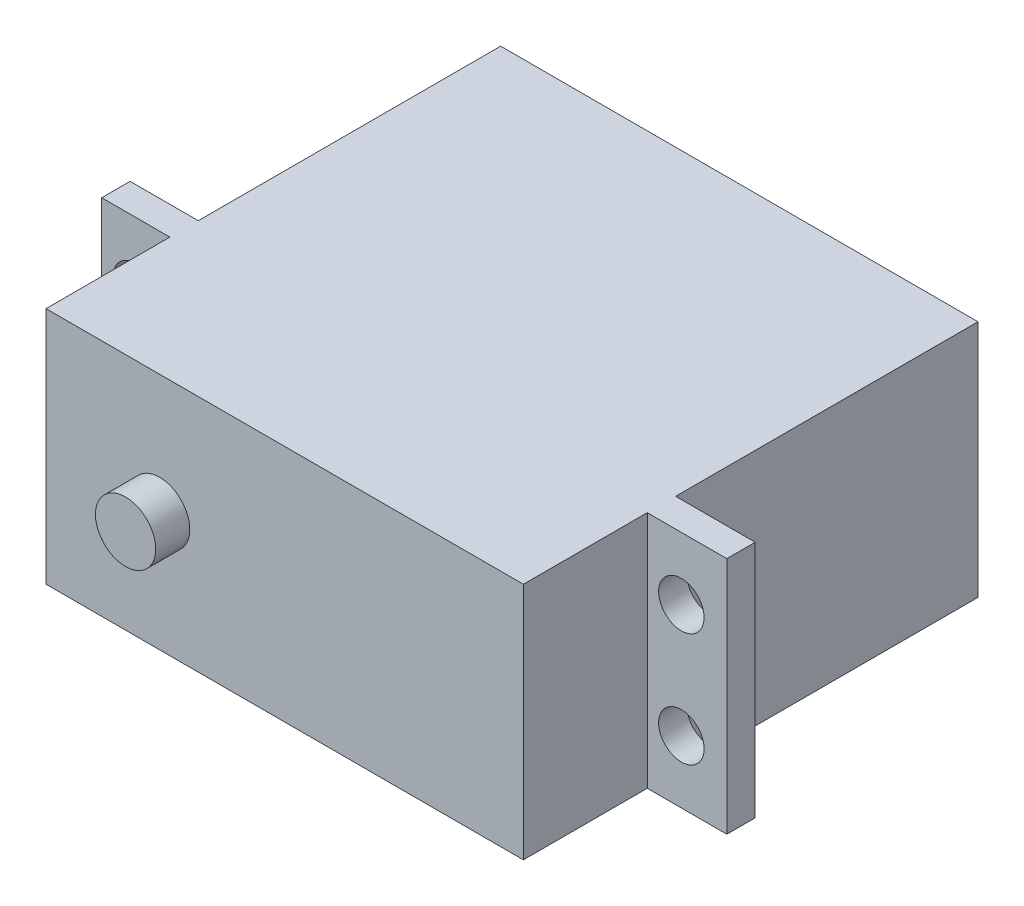
ISO-10303-21;
HEADER;
FILE_DESCRIPTION(('STEP AP214'),'2;1');
FILE_NAME('part.step','',(''),(''),'','','');
FILE_SCHEMA(('AUTOMOTIVE_DESIGN { 1 0 10303 214 1 1 1 1 }'));
ENDSEC;
DATA;
#1=APPLICATION_CONTEXT('core data for automotive mechanical design processes');
#2=APPLICATION_PROTOCOL_DEFINITION('international standard','automotive_design',2000,#1);
#3=PRODUCT_CONTEXT('',#1,'mechanical');
#4=PRODUCT('Part','Part','',(#3));
#5=PRODUCT_RELATED_PRODUCT_CATEGORY('part','',(#4));
#6=PRODUCT_DEFINITION_FORMATION('','',#4);
#7=PRODUCT_DEFINITION_CONTEXT('part definition',#1,'design');
#8=PRODUCT_DEFINITION('design','',#6,#7);
#9=PRODUCT_DEFINITION_SHAPE('','',#8);
#10=(LENGTH_UNIT() NAMED_UNIT(*) SI_UNIT(.MILLI.,.METRE.));
#11=(NAMED_UNIT(*) PLANE_ANGLE_UNIT() SI_UNIT($,.RADIAN.));
#12=(NAMED_UNIT(*) SI_UNIT($,.STERADIAN.) SOLID_ANGLE_UNIT());
#13=UNCERTAINTY_MEASURE_WITH_UNIT(LENGTH_MEASURE(1.E-05),#10,'distance_accuracy_value','');
#14=(GEOMETRIC_REPRESENTATION_CONTEXT(3) GLOBAL_UNCERTAINTY_ASSIGNED_CONTEXT((#13)) GLOBAL_UNIT_ASSIGNED_CONTEXT((#10,
#11,#12)) REPRESENTATION_CONTEXT('',''));
#15=CARTESIAN_POINT('',(0.,0.,0.));
#16=DIRECTION('',(0.,0.,1.));
#17=DIRECTION('',(1.,0.,0.));
#18=AXIS2_PLACEMENT_3D('',#15,#16,#17);
#19=CARTESIAN_POINT('',(-10.,-10.5,-40.));
#20=DIRECTION('',(-1.,0.,0.));
#21=DIRECTION('',(0.,0.,1.));
#22=AXIS2_PLACEMENT_3D('',#19,#20,#21);
#23=PLANE('',#22);
#24=DIRECTION('',(0.,-1.,0.));
#25=VECTOR('',#24,1.);
#26=CARTESIAN_POINT('',(-10.,-10.5,-13.4));
#27=LINE('',#26,#25);
#28=CARTESIAN_POINT('',(-10.,10.5,-13.4));
#29=VERTEX_POINT('',#28);
#30=CARTESIAN_POINT('',(-10.,-10.5,-13.4));
#31=VERTEX_POINT('',#30);
#32=EDGE_CURVE('E186',#29,#31,#27,.T.);
#33=ORIENTED_EDGE('',*,*,#32,.F.);
#34=DIRECTION('',(0.,0.,1.));
#35=VECTOR('',#34,1.);
#36=CARTESIAN_POINT('',(-10.,10.5,-40.));
#37=LINE('',#36,#35);
#38=CARTESIAN_POINT('',(-10.,10.5,-40.));
#39=VERTEX_POINT('',#38);
#40=EDGE_CURVE('E11',#39,#29,#37,.T.);
#41=ORIENTED_EDGE('',*,*,#40,.F.);
#42=DIRECTION('',(0.,-1.,0.));
#43=VECTOR('',#42,1.);
#44=CARTESIAN_POINT('',(-10.,-10.5,-40.));
#45=LINE('',#44,#43);
#46=CARTESIAN_POINT('',(-10.,-10.5,-40.));
#47=VERTEX_POINT('',#46);
#48=EDGE_CURVE('E189',#39,#47,#45,.T.);
#49=ORIENTED_EDGE('',*,*,#48,.T.);
#50=DIRECTION('',(0.,0.,1.));
#51=VECTOR('',#50,1.);
#52=CARTESIAN_POINT('',(-10.,-10.5,-40.));
#53=LINE('',#52,#51);
#54=EDGE_CURVE('E218',#47,#31,#53,.T.);
#55=ORIENTED_EDGE('',*,*,#54,.T.);
#56=EDGE_LOOP('',(#33,#41,#49,#55));
#57=FACE_BOUND('',#56,.T.);
#58=ADVANCED_FACE('F38',(#57),#23,.T.);
#59=CARTESIAN_POINT('',(32.,-10.5,-40.));
#60=DIRECTION('',(1.,0.,0.));
#61=DIRECTION('',(0.,0.,-1.));
#62=AXIS2_PLACEMENT_3D('',#59,#60,#61);
#63=PLANE('',#62);
#64=DIRECTION('',(0.,1.,0.));
#65=VECTOR('',#64,1.);
#66=CARTESIAN_POINT('',(32.,-10.5,-13.4));
#67=LINE('',#66,#65);
#68=CARTESIAN_POINT('',(32.,-10.5,-13.4));
#69=VERTEX_POINT('',#68);
#70=CARTESIAN_POINT('',(32.,10.5,-13.4));
#71=VERTEX_POINT('',#70);
#72=EDGE_CURVE('E135',#69,#71,#67,.T.);
#73=ORIENTED_EDGE('',*,*,#72,.F.);
#74=DIRECTION('',(0.,0.,1.));
#75=VECTOR('',#74,1.);
#76=CARTESIAN_POINT('',(32.,-10.5,-40.));
#77=LINE('',#76,#75);
#78=CARTESIAN_POINT('',(32.,-10.5,-40.));
#79=VERTEX_POINT('',#78);
#80=EDGE_CURVE('E214',#79,#69,#77,.T.);
#81=ORIENTED_EDGE('',*,*,#80,.F.);
#82=DIRECTION('',(0.,1.,0.));
#83=VECTOR('',#82,1.);
#84=CARTESIAN_POINT('',(32.,-10.5,-40.));
#85=LINE('',#84,#83);
#86=CARTESIAN_POINT('',(32.,10.5,-40.));
#87=VERTEX_POINT('',#86);
#88=EDGE_CURVE('E196',#79,#87,#85,.T.);
#89=ORIENTED_EDGE('',*,*,#88,.T.);
#90=DIRECTION('',(0.,0.,1.));
#91=VECTOR('',#90,1.);
#92=CARTESIAN_POINT('',(32.,10.5,-40.));
#93=LINE('',#92,#91);
#94=EDGE_CURVE('E63',#87,#71,#93,.T.);
#95=ORIENTED_EDGE('',*,*,#94,.T.);
#96=EDGE_LOOP('',(#73,#81,#89,#95));
#97=FACE_BOUND('',#96,.T.);
#98=ADVANCED_FACE('F260',(#97),#63,.T.);
#99=DIRECTION('',(0.,1.,0.));
#100=VECTOR('',#99,1.);
#101=CARTESIAN_POINT('',(-10.,-10.5,-10.9));
#102=LINE('',#101,#100);
#103=CARTESIAN_POINT('',(-10.,-10.5,-10.9));
#104=VERTEX_POINT('',#103);
#105=CARTESIAN_POINT('',(-10.,10.5,-10.9));
#106=VERTEX_POINT('',#105);
#107=EDGE_CURVE('E183',#104,#106,#102,.T.);
#108=ORIENTED_EDGE('',*,*,#107,.F.);
#109=CARTESIAN_POINT('',(-10.,-10.5,0.));
#110=VERTEX_POINT('',#109);
#111=EDGE_CURVE('E201',#104,#110,#53,.T.);
#112=ORIENTED_EDGE('',*,*,#111,.T.);
#113=DIRECTION('',(0.,-1.,0.));
#114=VECTOR('',#113,1.);
#115=CARTESIAN_POINT('',(-10.,-10.5,0.));
#116=LINE('',#115,#114);
#117=CARTESIAN_POINT('',(-10.,10.5,0.));
#118=VERTEX_POINT('',#117);
#119=EDGE_CURVE('E188',#118,#110,#116,.T.);
#120=ORIENTED_EDGE('',*,*,#119,.F.);
#121=EDGE_CURVE('E47',#106,#118,#37,.T.);
#122=ORIENTED_EDGE('',*,*,#121,.F.);
#123=EDGE_LOOP('',(#108,#112,#120,#122));
#124=FACE_BOUND('',#123,.T.);
#125=ADVANCED_FACE('F40',(#124),#23,.T.);
#126=CARTESIAN_POINT('',(-10.,10.5,-40.));
#127=DIRECTION('',(0.,1.,0.));
#128=DIRECTION('',(0.,0.,1.));
#129=AXIS2_PLACEMENT_3D('',#126,#127,#128);
#130=PLANE('',#129);
#131=CARTESIAN_POINT('',(32.,10.5,-10.9));
#132=VERTEX_POINT('',#131);
#133=CARTESIAN_POINT('',(32.,10.5,0.));
#134=VERTEX_POINT('',#133);
#135=EDGE_CURVE('E213',#132,#134,#93,.T.);
#136=ORIENTED_EDGE('',*,*,#135,.F.);
#137=DIRECTION('',(1.,0.,0.));
#138=VECTOR('',#137,1.);
#139=CARTESIAN_POINT('',(-16.,10.5,-10.9));
#140=LINE('',#139,#138);
#141=CARTESIAN_POINT('',(39.,10.5,-10.9));
#142=VERTEX_POINT('',#141);
#143=EDGE_CURVE('E143',#132,#142,#140,.T.);
#144=ORIENTED_EDGE('',*,*,#143,.T.);
#145=DIRECTION('',(0.,0.,1.));
#146=VECTOR('',#145,1.);
#147=CARTESIAN_POINT('',(39.,10.5,-13.4));
#148=LINE('',#147,#146);
#149=CARTESIAN_POINT('',(39.,10.5,-13.4));
#150=VERTEX_POINT('',#149);
#151=EDGE_CURVE('E140',#150,#142,#148,.T.);
#152=ORIENTED_EDGE('',*,*,#151,.F.);
#153=DIRECTION('',(1.,0.,0.));
#154=VECTOR('',#153,1.);
#155=CARTESIAN_POINT('',(-16.,10.5,-13.4));
#156=LINE('',#155,#154);
#157=EDGE_CURVE('E129',#71,#150,#156,.T.);
#158=ORIENTED_EDGE('',*,*,#157,.F.);
#159=ORIENTED_EDGE('',*,*,#94,.F.);
#160=DIRECTION('',(-1.,0.,0.));
#161=VECTOR('',#160,1.);
#162=CARTESIAN_POINT('',(-10.,10.5,-40.));
#163=LINE('',#162,#161);
#164=EDGE_CURVE('E198',#87,#39,#163,.T.);
#165=ORIENTED_EDGE('',*,*,#164,.T.);
#166=ORIENTED_EDGE('',*,*,#40,.T.);
#167=CARTESIAN_POINT('',(-16.,10.5,-13.4));
#168=VERTEX_POINT('',#167);
#169=EDGE_CURVE('E136',#168,#29,#156,.T.);
#170=ORIENTED_EDGE('',*,*,#169,.F.);
#171=DIRECTION('',(0.,0.,1.));
#172=VECTOR('',#171,1.);
#173=CARTESIAN_POINT('',(-16.,10.5,-13.4));
#174=LINE('',#173,#172);
#175=CARTESIAN_POINT('',(-16.,10.5,-10.9));
#176=VERTEX_POINT('',#175);
#177=EDGE_CURVE('E165',#168,#176,#174,.T.);
#178=ORIENTED_EDGE('',*,*,#177,.T.);
#179=EDGE_CURVE('E55',#176,#106,#140,.T.);
#180=ORIENTED_EDGE('',*,*,#179,.T.);
#181=ORIENTED_EDGE('',*,*,#121,.T.);
#182=DIRECTION('',(-1.,0.,0.));
#183=VECTOR('',#182,1.);
#184=CARTESIAN_POINT('',(-10.,10.5,0.));
#185=LINE('',#184,#183);
#186=EDGE_CURVE('E193',#134,#118,#185,.T.);
#187=ORIENTED_EDGE('',*,*,#186,.F.);
#188=EDGE_LOOP('',(#136,#144,#152,#158,#159,#165,#166,#170,#178,#180,#181,#187));
#189=FACE_BOUND('',#188,.T.);
#190=ADVANCED_FACE('F141',(#189),#130,.T.);
#191=DIRECTION('',(0.,-1.,0.));
#192=VECTOR('',#191,1.);
#193=CARTESIAN_POINT('',(32.,-10.5,-10.9));
#194=LINE('',#193,#192);
#195=CARTESIAN_POINT('',(32.,-10.5,-10.9));
#196=VERTEX_POINT('',#195);
#197=EDGE_CURVE('E175',#132,#196,#194,.T.);
#198=ORIENTED_EDGE('',*,*,#197,.F.);
#199=ORIENTED_EDGE('',*,*,#135,.T.);
#200=DIRECTION('',(0.,1.,0.));
#201=VECTOR('',#200,1.);
#202=CARTESIAN_POINT('',(32.,-10.5,0.));
#203=LINE('',#202,#201);
#204=CARTESIAN_POINT('',(32.,-10.5,0.));
#205=VERTEX_POINT('',#204);
#206=EDGE_CURVE('E207',#205,#134,#203,.T.);
#207=ORIENTED_EDGE('',*,*,#206,.F.);
#208=EDGE_CURVE('E217',#196,#205,#77,.T.);
#209=ORIENTED_EDGE('',*,*,#208,.F.);
#210=EDGE_LOOP('',(#198,#199,#207,#209));
#211=FACE_BOUND('',#210,.T.);
#212=ADVANCED_FACE('F266',(#211),#63,.T.);
#213=CARTESIAN_POINT('',(-10.,-10.5,-40.));
#214=DIRECTION('',(0.,-1.,0.));
#215=DIRECTION('',(0.,0.,-1.));
#216=AXIS2_PLACEMENT_3D('',#213,#214,#215);
#217=PLANE('',#216);
#218=ORIENTED_EDGE('',*,*,#111,.F.);
#219=DIRECTION('',(1.,0.,0.));
#220=VECTOR('',#219,1.);
#221=CARTESIAN_POINT('',(-16.,-10.5,-10.9));
#222=LINE('',#221,#220);
#223=CARTESIAN_POINT('',(-16.,-10.5,-10.9));
#224=VERTEX_POINT('',#223);
#225=EDGE_CURVE('E177',#224,#104,#222,.T.);
#226=ORIENTED_EDGE('',*,*,#225,.F.);
#227=DIRECTION('',(0.,0.,-1.));
#228=VECTOR('',#227,1.);
#229=CARTESIAN_POINT('',(-16.,-10.5,-13.4));
#230=LINE('',#229,#228);
#231=CARTESIAN_POINT('',(-16.,-10.5,-13.4));
#232=VERTEX_POINT('',#231);
#233=EDGE_CURVE('E137',#224,#232,#230,.T.);
#234=ORIENTED_EDGE('',*,*,#233,.T.);
#235=DIRECTION('',(1.,0.,0.));
#236=VECTOR('',#235,1.);
#237=CARTESIAN_POINT('',(-16.,-10.5,-13.4));
#238=LINE('',#237,#236);
#239=EDGE_CURVE('E172',#232,#31,#238,.T.);
#240=ORIENTED_EDGE('',*,*,#239,.T.);
#241=ORIENTED_EDGE('',*,*,#54,.F.);
#242=DIRECTION('',(1.,0.,0.));
#243=VECTOR('',#242,1.);
#244=CARTESIAN_POINT('',(-10.,-10.5,-40.));
#245=LINE('',#244,#243);
#246=EDGE_CURVE('E192',#47,#79,#245,.T.);
#247=ORIENTED_EDGE('',*,*,#246,.T.);
#248=ORIENTED_EDGE('',*,*,#80,.T.);
#249=CARTESIAN_POINT('',(39.,-10.5,-13.4));
#250=VERTEX_POINT('',#249);
#251=EDGE_CURVE('E176',#69,#250,#238,.T.);
#252=ORIENTED_EDGE('',*,*,#251,.T.);
#253=DIRECTION('',(0.,0.,-1.));
#254=VECTOR('',#253,1.);
#255=CARTESIAN_POINT('',(39.,-10.5,-13.4));
#256=LINE('',#255,#254);
#257=CARTESIAN_POINT('',(39.,-10.5,-10.9));
#258=VERTEX_POINT('',#257);
#259=EDGE_CURVE('E152',#258,#250,#256,.T.);
#260=ORIENTED_EDGE('',*,*,#259,.F.);
#261=EDGE_CURVE('E179',#196,#258,#222,.T.);
#262=ORIENTED_EDGE('',*,*,#261,.F.);
#263=ORIENTED_EDGE('',*,*,#208,.T.);
#264=DIRECTION('',(1.,0.,0.));
#265=VECTOR('',#264,1.);
#266=CARTESIAN_POINT('',(-10.,-10.5,0.));
#267=LINE('',#266,#265);
#268=EDGE_CURVE('E204',#110,#205,#267,.T.);
#269=ORIENTED_EDGE('',*,*,#268,.F.);
#270=EDGE_LOOP('',(#218,#226,#234,#240,#241,#247,#248,#252,#260,#262,#263,#269));
#271=FACE_BOUND('',#270,.T.);
#272=ADVANCED_FACE('F281',(#271),#217,.T.);
#273=CARTESIAN_POINT('',(0.,0.,-40.));
#274=DIRECTION('',(0.,0.,-1.));
#275=DIRECTION('',(-1.,0.,0.));
#276=AXIS2_PLACEMENT_3D('',#273,#274,#275);
#277=PLANE('',#276);
#278=ORIENTED_EDGE('',*,*,#48,.F.);
#279=ORIENTED_EDGE('',*,*,#164,.F.);
#280=ORIENTED_EDGE('',*,*,#88,.F.);
#281=ORIENTED_EDGE('',*,*,#246,.F.);
#282=EDGE_LOOP('',(#278,#279,#280,#281));
#283=FACE_BOUND('',#282,.T.);
#284=ADVANCED_FACE('F296',(#283),#277,.T.);
#285=CARTESIAN_POINT('',(0.,0.,0.));
#286=DIRECTION('',(0.,0.,-1.));
#287=DIRECTION('',(-1.,0.,0.));
#288=AXIS2_PLACEMENT_3D('',#285,#286,#287);
#289=PLANE('',#288);
#290=CARTESIAN_POINT('',(0.,0.,0.));
#291=DIRECTION('',(0.,0.,-1.));
#292=DIRECTION('',(-1.,0.,0.));
#293=AXIS2_PLACEMENT_3D('',#290,#291,#292);
#294=CIRCLE('',#293,2.65);
#295=CARTESIAN_POINT('',(-2.65,0.,0.));
#296=VERTEX_POINT('',#295);
#297=EDGE_CURVE('E242',#296,#296,#294,.T.);
#298=ORIENTED_EDGE('',*,*,#297,.T.);
#299=EDGE_LOOP('',(#298));
#300=FACE_BOUND('',#299,.T.);
#301=ORIENTED_EDGE('',*,*,#119,.T.);
#302=ORIENTED_EDGE('',*,*,#268,.T.);
#303=ORIENTED_EDGE('',*,*,#206,.T.);
#304=ORIENTED_EDGE('',*,*,#186,.T.);
#305=EDGE_LOOP('',(#301,#302,#303,#304));
#306=FACE_BOUND('',#305,.T.);
#307=ADVANCED_FACE('F285',(#300,#306),#289,.F.);
#308=CARTESIAN_POINT('',(39.,0.,0.));
#309=DIRECTION('',(-1.,0.,0.));
#310=DIRECTION('',(0.,0.,1.));
#311=AXIS2_PLACEMENT_3D('',#308,#309,#310);
#312=PLANE('',#311);
#313=DIRECTION('',(0.,1.,0.));
#314=VECTOR('',#313,1.);
#315=CARTESIAN_POINT('',(39.,10.5,-13.4));
#316=LINE('',#315,#314);
#317=EDGE_CURVE('E134',#250,#150,#316,.T.);
#318=ORIENTED_EDGE('',*,*,#317,.T.);
#319=ORIENTED_EDGE('',*,*,#151,.T.);
#320=DIRECTION('',(0.,-1.,0.));
#321=VECTOR('',#320,1.);
#322=CARTESIAN_POINT('',(39.,10.5,-10.9));
#323=LINE('',#322,#321);
#324=EDGE_CURVE('E147',#142,#258,#323,.T.);
#325=ORIENTED_EDGE('',*,*,#324,.T.);
#326=ORIENTED_EDGE('',*,*,#259,.T.);
#327=EDGE_LOOP('',(#318,#319,#325,#326));
#328=FACE_BOUND('',#327,.T.);
#329=ADVANCED_FACE('F150',(#328),#312,.F.);
#330=CARTESIAN_POINT('',(-16.,10.5,-10.9));
#331=DIRECTION('',(0.,0.,1.));
#332=DIRECTION('',(0.,-1.,0.));
#333=AXIS2_PLACEMENT_3D('',#330,#331,#332);
#334=PLANE('',#333);
#335=CARTESIAN_POINT('',(35.,5.,-10.9));
#336=DIRECTION('',(0.,0.,1.));
#337=DIRECTION('',(0.,-1.,0.));
#338=AXIS2_PLACEMENT_3D('',#335,#336,#337);
#339=CIRCLE('',#338,2.);
#340=CARTESIAN_POINT('',(35.,3.,-10.9));
#341=VERTEX_POINT('',#340);
#342=EDGE_CURVE('E235',#341,#341,#339,.T.);
#343=ORIENTED_EDGE('',*,*,#342,.F.);
#344=EDGE_LOOP('',(#343));
#345=FACE_BOUND('',#344,.T.);
#346=CARTESIAN_POINT('',(35.,-5.,-10.9));
#347=DIRECTION('',(0.,0.,1.));
#348=DIRECTION('',(0.,-1.,0.));
#349=AXIS2_PLACEMENT_3D('',#346,#347,#348);
#350=CIRCLE('',#349,2.);
#351=CARTESIAN_POINT('',(35.,-7.,-10.9));
#352=VERTEX_POINT('',#351);
#353=EDGE_CURVE('E153',#352,#352,#350,.T.);
#354=ORIENTED_EDGE('',*,*,#353,.F.);
#355=EDGE_LOOP('',(#354));
#356=FACE_BOUND('',#355,.T.);
#357=ORIENTED_EDGE('',*,*,#143,.F.);
#358=ORIENTED_EDGE('',*,*,#197,.T.);
#359=ORIENTED_EDGE('',*,*,#261,.T.);
#360=ORIENTED_EDGE('',*,*,#324,.F.);
#361=EDGE_LOOP('',(#357,#358,#359,#360));
#362=FACE_BOUND('',#361,.T.);
#363=ADVANCED_FACE('F290',(#345,#356,#362),#334,.T.);
#364=CARTESIAN_POINT('',(-16.,10.5,-13.4));
#365=DIRECTION('',(0.,0.,-1.));
#366=DIRECTION('',(0.,1.,0.));
#367=AXIS2_PLACEMENT_3D('',#364,#365,#366);
#368=PLANE('',#367);
#369=CARTESIAN_POINT('',(35.,5.,-13.4));
#370=DIRECTION('',(0.,0.,-1.));
#371=DIRECTION('',(-1.,0.,0.));
#372=AXIS2_PLACEMENT_3D('',#369,#370,#371);
#373=CIRCLE('',#372,2.);
#374=CARTESIAN_POINT('',(33.,5.,-13.4));
#375=VERTEX_POINT('',#374);
#376=EDGE_CURVE('E238',#375,#375,#373,.T.);
#377=ORIENTED_EDGE('',*,*,#376,.F.);
#378=EDGE_LOOP('',(#377));
#379=FACE_BOUND('',#378,.T.);
#380=CARTESIAN_POINT('',(35.,-5.,-13.4));
#381=DIRECTION('',(0.,0.,-1.));
#382=DIRECTION('',(1.,0.,0.));
#383=AXIS2_PLACEMENT_3D('',#380,#381,#382);
#384=CIRCLE('',#383,2.);
#385=CARTESIAN_POINT('',(37.,-5.,-13.4));
#386=VERTEX_POINT('',#385);
#387=EDGE_CURVE('E156',#386,#386,#384,.T.);
#388=ORIENTED_EDGE('',*,*,#387,.F.);
#389=EDGE_LOOP('',(#388));
#390=FACE_BOUND('',#389,.T.);
#391=ORIENTED_EDGE('',*,*,#251,.F.);
#392=ORIENTED_EDGE('',*,*,#72,.T.);
#393=ORIENTED_EDGE('',*,*,#157,.T.);
#394=ORIENTED_EDGE('',*,*,#317,.F.);
#395=EDGE_LOOP('',(#391,#392,#393,#394));
#396=FACE_BOUND('',#395,.T.);
#397=ADVANCED_FACE('F132',(#379,#390,#396),#368,.T.);
#398=CARTESIAN_POINT('',(-13.,5.,-13.4));
#399=DIRECTION('',(0.,0.,-1.));
#400=DIRECTION('',(1.,0.,0.));
#401=AXIS2_PLACEMENT_3D('',#398,#399,#400);
#402=CIRCLE('',#401,2.);
#403=CARTESIAN_POINT('',(-11.,5.,-13.4));
#404=VERTEX_POINT('',#403);
#405=EDGE_CURVE('E231',#404,#404,#402,.T.);
#406=ORIENTED_EDGE('',*,*,#405,.F.);
#407=EDGE_LOOP('',(#406));
#408=FACE_BOUND('',#407,.T.);
#409=CARTESIAN_POINT('',(-13.,-5.,-13.4));
#410=DIRECTION('',(0.,0.,-1.));
#411=DIRECTION('',(-1.,0.,0.));
#412=AXIS2_PLACEMENT_3D('',#409,#410,#411);
#413=CIRCLE('',#412,2.);
#414=CARTESIAN_POINT('',(-15.,-5.,-13.4));
#415=VERTEX_POINT('',#414);
#416=EDGE_CURVE('E222',#415,#415,#413,.T.);
#417=ORIENTED_EDGE('',*,*,#416,.F.);
#418=EDGE_LOOP('',(#417));
#419=FACE_BOUND('',#418,.T.);
#420=ORIENTED_EDGE('',*,*,#169,.T.);
#421=ORIENTED_EDGE('',*,*,#32,.T.);
#422=ORIENTED_EDGE('',*,*,#239,.F.);
#423=DIRECTION('',(0.,1.,0.));
#424=VECTOR('',#423,1.);
#425=CARTESIAN_POINT('',(-16.,10.5,-13.4));
#426=LINE('',#425,#424);
#427=EDGE_CURVE('E162',#232,#168,#426,.T.);
#428=ORIENTED_EDGE('',*,*,#427,.T.);
#429=EDGE_LOOP('',(#420,#421,#422,#428));
#430=FACE_BOUND('',#429,.T.);
#431=ADVANCED_FACE('F299',(#408,#419,#430),#368,.T.);
#432=CARTESIAN_POINT('',(-13.,5.,-10.9));
#433=DIRECTION('',(0.,0.,1.));
#434=DIRECTION('',(0.,-1.,0.));
#435=AXIS2_PLACEMENT_3D('',#432,#433,#434);
#436=CIRCLE('',#435,2.);
#437=CARTESIAN_POINT('',(-13.,3.,-10.9));
#438=VERTEX_POINT('',#437);
#439=EDGE_CURVE('E42',#438,#438,#436,.T.);
#440=ORIENTED_EDGE('',*,*,#439,.F.);
#441=EDGE_LOOP('',(#440));
#442=FACE_BOUND('',#441,.T.);
#443=CARTESIAN_POINT('',(-13.,-5.,-10.9));
#444=DIRECTION('',(0.,0.,1.));
#445=DIRECTION('',(0.,-1.,0.));
#446=AXIS2_PLACEMENT_3D('',#443,#444,#445);
#447=CIRCLE('',#446,2.);
#448=CARTESIAN_POINT('',(-13.,-7.,-10.9));
#449=VERTEX_POINT('',#448);
#450=EDGE_CURVE('E220',#449,#449,#447,.T.);
#451=ORIENTED_EDGE('',*,*,#450,.F.);
#452=EDGE_LOOP('',(#451));
#453=FACE_BOUND('',#452,.T.);
#454=ORIENTED_EDGE('',*,*,#225,.T.);
#455=ORIENTED_EDGE('',*,*,#107,.T.);
#456=ORIENTED_EDGE('',*,*,#179,.F.);
#457=DIRECTION('',(0.,-1.,0.));
#458=VECTOR('',#457,1.);
#459=CARTESIAN_POINT('',(-16.,10.5,-10.9));
#460=LINE('',#459,#458);
#461=EDGE_CURVE('E167',#176,#224,#460,.T.);
#462=ORIENTED_EDGE('',*,*,#461,.T.);
#463=EDGE_LOOP('',(#454,#455,#456,#462));
#464=FACE_BOUND('',#463,.T.);
#465=ADVANCED_FACE('F305',(#442,#453,#464),#334,.T.);
#466=CARTESIAN_POINT('',(-16.,0.,0.));
#467=DIRECTION('',(-1.,0.,0.));
#468=DIRECTION('',(0.,0.,1.));
#469=AXIS2_PLACEMENT_3D('',#466,#467,#468);
#470=PLANE('',#469);
#471=ORIENTED_EDGE('',*,*,#427,.F.);
#472=ORIENTED_EDGE('',*,*,#233,.F.);
#473=ORIENTED_EDGE('',*,*,#461,.F.);
#474=ORIENTED_EDGE('',*,*,#177,.F.);
#475=EDGE_LOOP('',(#471,#472,#473,#474));
#476=FACE_BOUND('',#475,.T.);
#477=ADVANCED_FACE('F304',(#476),#470,.T.);
#478=CARTESIAN_POINT('',(35.,-5.,-5.9));
#479=DIRECTION('',(0.,0.,-1.));
#480=DIRECTION('',(-1.,0.,0.));
#481=AXIS2_PLACEMENT_3D('',#478,#479,#480);
#482=CYLINDRICAL_SURFACE('',#481,2.);
#483=ORIENTED_EDGE('',*,*,#353,.T.);
#484=EDGE_LOOP('',(#483));
#485=FACE_BOUND('',#484,.T.);
#486=ORIENTED_EDGE('',*,*,#387,.T.);
#487=EDGE_LOOP('',(#486));
#488=FACE_BOUND('',#487,.T.);
#489=ADVANCED_FACE('F313',(#485,#488),#482,.F.);
#490=CARTESIAN_POINT('',(-13.,-5.,-5.9));
#491=DIRECTION('',(0.,0.,-1.));
#492=DIRECTION('',(-1.,0.,0.));
#493=AXIS2_PLACEMENT_3D('',#490,#491,#492);
#494=CYLINDRICAL_SURFACE('',#493,2.);
#495=ORIENTED_EDGE('',*,*,#450,.T.);
#496=EDGE_LOOP('',(#495));
#497=FACE_BOUND('',#496,.T.);
#498=ORIENTED_EDGE('',*,*,#416,.T.);
#499=EDGE_LOOP('',(#498));
#500=FACE_BOUND('',#499,.T.);
#501=ADVANCED_FACE('F333',(#497,#500),#494,.F.);
#502=CARTESIAN_POINT('',(-13.,5.,-5.9));
#503=DIRECTION('',(0.,0.,-1.));
#504=DIRECTION('',(-1.,0.,0.));
#505=AXIS2_PLACEMENT_3D('',#502,#503,#504);
#506=CYLINDRICAL_SURFACE('',#505,2.);
#507=ORIENTED_EDGE('',*,*,#439,.T.);
#508=EDGE_LOOP('',(#507));
#509=FACE_BOUND('',#508,.T.);
#510=ORIENTED_EDGE('',*,*,#405,.T.);
#511=EDGE_LOOP('',(#510));
#512=FACE_BOUND('',#511,.T.);
#513=ADVANCED_FACE('F340',(#509,#512),#506,.F.);
#514=CARTESIAN_POINT('',(35.,5.,-5.9));
#515=DIRECTION('',(0.,0.,-1.));
#516=DIRECTION('',(-1.,0.,0.));
#517=AXIS2_PLACEMENT_3D('',#514,#515,#516);
#518=CYLINDRICAL_SURFACE('',#517,2.);
#519=ORIENTED_EDGE('',*,*,#342,.T.);
#520=EDGE_LOOP('',(#519));
#521=FACE_BOUND('',#520,.T.);
#522=ORIENTED_EDGE('',*,*,#376,.T.);
#523=EDGE_LOOP('',(#522));
#524=FACE_BOUND('',#523,.T.);
#525=ADVANCED_FACE('F257',(#521,#524),#518,.F.);
#526=CARTESIAN_POINT('',(0.,0.,3.));
#527=DIRECTION('',(0.,0.,-1.));
#528=DIRECTION('',(-1.,0.,0.));
#529=AXIS2_PLACEMENT_3D('',#526,#527,#528);
#530=CYLINDRICAL_SURFACE('',#529,2.65);
#531=CARTESIAN_POINT('',(0.,0.,3.));
#532=DIRECTION('',(0.,0.,-1.));
#533=DIRECTION('',(-1.,0.,0.));
#534=AXIS2_PLACEMENT_3D('',#531,#532,#533);
#535=CIRCLE('',#534,2.65);
#536=CARTESIAN_POINT('',(-2.65,0.,3.));
#537=VERTEX_POINT('',#536);
#538=EDGE_CURVE('E241',#537,#537,#535,.T.);
#539=ORIENTED_EDGE('',*,*,#538,.T.);
#540=EDGE_LOOP('',(#539));
#541=FACE_BOUND('',#540,.T.);
#542=ORIENTED_EDGE('',*,*,#297,.F.);
#543=EDGE_LOOP('',(#542));
#544=FACE_BOUND('',#543,.T.);
#545=ADVANCED_FACE('F248',(#541,#544),#530,.T.);
#546=CARTESIAN_POINT('',(0.,0.,3.));
#547=DIRECTION('',(0.,0.,-1.));
#548=DIRECTION('',(-1.,0.,0.));
#549=AXIS2_PLACEMENT_3D('',#546,#547,#548);
#550=PLANE('',#549);
#551=ORIENTED_EDGE('',*,*,#538,.F.);
#552=EDGE_LOOP('',(#551));
#553=FACE_BOUND('',#552,.T.);
#554=ADVANCED_FACE('F251',(#553),#550,.F.);
#555=CLOSED_SHELL('',(#58,#98,#125,#190,#212,#272,#284,#307,#329,#363,#397,#431,#465,#477,#489,
#501,#513,#525,#545,#554));
#556=MANIFOLD_SOLID_BREP('B2',#555);
#557=ADVANCED_BREP_SHAPE_REPRESENTATION('',(#18,#556),#14);
#558=SHAPE_DEFINITION_REPRESENTATION(#9,#557);
ENDSEC;
END-ISO-10303-21;
